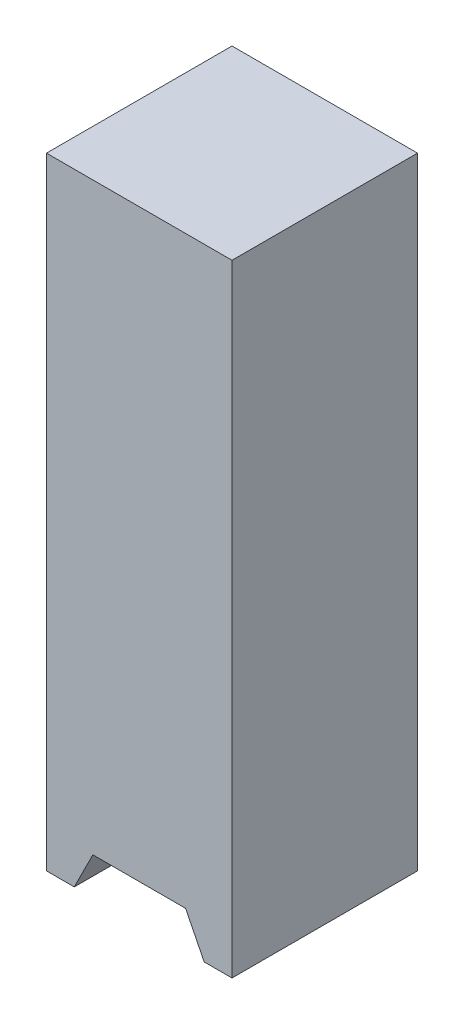
ISO-10303-21;
HEADER;
FILE_DESCRIPTION(('STEP AP214'),'2;1');
FILE_NAME('part.step','',(''),(''),'','','');
FILE_SCHEMA(('AUTOMOTIVE_DESIGN { 1 0 10303 214 1 1 1 1 }'));
ENDSEC;
DATA;
#1=APPLICATION_CONTEXT('core data for automotive mechanical design processes');
#2=APPLICATION_PROTOCOL_DEFINITION('international standard','automotive_design',2000,#1);
#3=PRODUCT_CONTEXT('',#1,'mechanical');
#4=PRODUCT('Part','Part','',(#3));
#5=PRODUCT_RELATED_PRODUCT_CATEGORY('part','',(#4));
#6=PRODUCT_DEFINITION_FORMATION('','',#4);
#7=PRODUCT_DEFINITION_CONTEXT('part definition',#1,'design');
#8=PRODUCT_DEFINITION('design','',#6,#7);
#9=PRODUCT_DEFINITION_SHAPE('','',#8);
#10=(LENGTH_UNIT() NAMED_UNIT(*) SI_UNIT(.MILLI.,.METRE.));
#11=(NAMED_UNIT(*) PLANE_ANGLE_UNIT() SI_UNIT($,.RADIAN.));
#12=(NAMED_UNIT(*) SI_UNIT($,.STERADIAN.) SOLID_ANGLE_UNIT());
#13=UNCERTAINTY_MEASURE_WITH_UNIT(LENGTH_MEASURE(1.E-05),#10,'distance_accuracy_value','');
#14=(GEOMETRIC_REPRESENTATION_CONTEXT(3) GLOBAL_UNCERTAINTY_ASSIGNED_CONTEXT((#13)) GLOBAL_UNIT_ASSIGNED_CONTEXT((#10,
#11,#12)) REPRESENTATION_CONTEXT('',''));
#15=CARTESIAN_POINT('',(0.,0.,0.));
#16=DIRECTION('',(0.,0.,1.));
#17=DIRECTION('',(1.,0.,0.));
#18=AXIS2_PLACEMENT_3D('',#15,#16,#17);
#19=CARTESIAN_POINT('',(0.,0.,0.));
#20=DIRECTION('',(0.,-1.,0.));
#21=DIRECTION('',(0.,0.,-1.));
#22=AXIS2_PLACEMENT_3D('',#19,#20,#21);
#23=PLANE('',#22);
#24=DIRECTION('',(0.,0.,-1.));
#25=VECTOR('',#24,1.);
#26=CARTESIAN_POINT('',(2.159,0.,0.));
#27=LINE('',#26,#25);
#28=CARTESIAN_POINT('',(2.159,0.,0.));
#29=VERTEX_POINT('',#28);
#30=CARTESIAN_POINT('',(2.159,0.,-2.54));
#31=VERTEX_POINT('',#30);
#32=EDGE_CURVE('E133',#29,#31,#27,.T.);
#33=ORIENTED_EDGE('',*,*,#32,.T.);
#34=DIRECTION('',(-1.,0.,0.));
#35=VECTOR('',#34,1.);
#36=CARTESIAN_POINT('',(0.,0.,-2.54));
#37=LINE('',#36,#35);
#38=CARTESIAN_POINT('',(2.54,0.,-2.54));
#39=VERTEX_POINT('',#38);
#40=EDGE_CURVE('E141',#39,#31,#37,.T.);
#41=ORIENTED_EDGE('',*,*,#40,.F.);
#42=DIRECTION('',(0.,0.,-1.));
#43=VECTOR('',#42,1.);
#44=CARTESIAN_POINT('',(2.54,0.,0.));
#45=LINE('',#44,#43);
#46=CARTESIAN_POINT('',(2.54,0.,0.));
#47=VERTEX_POINT('',#46);
#48=EDGE_CURVE('E151',#47,#39,#45,.T.);
#49=ORIENTED_EDGE('',*,*,#48,.F.);
#50=DIRECTION('',(1.,0.,0.));
#51=VECTOR('',#50,1.);
#52=CARTESIAN_POINT('',(0.,0.,0.));
#53=LINE('',#52,#51);
#54=EDGE_CURVE('E149',#29,#47,#53,.T.);
#55=ORIENTED_EDGE('',*,*,#54,.F.);
#56=EDGE_LOOP('',(#33,#41,#49,#55));
#57=FACE_BOUND('',#56,.T.);
#58=ADVANCED_FACE('F33',(#57),#23,.T.);
#59=CARTESIAN_POINT('',(0.,8.509,0.));
#60=DIRECTION('',(1.,0.,0.));
#61=DIRECTION('',(0.,0.,-1.));
#62=AXIS2_PLACEMENT_3D('',#59,#60,#61);
#63=PLANE('',#62);
#64=DIRECTION('',(0.,0.,1.));
#65=VECTOR('',#64,1.);
#66=CARTESIAN_POINT('',(0.,0.,0.));
#67=LINE('',#66,#65);
#68=CARTESIAN_POINT('',(0.,0.,-2.54));
#69=VERTEX_POINT('',#68);
#70=CARTESIAN_POINT('',(0.,0.,0.));
#71=VERTEX_POINT('',#70);
#72=EDGE_CURVE('E136',#69,#71,#67,.T.);
#73=ORIENTED_EDGE('',*,*,#72,.T.);
#74=DIRECTION('',(0.,-1.,0.));
#75=VECTOR('',#74,1.);
#76=CARTESIAN_POINT('',(0.,8.509,0.));
#77=LINE('',#76,#75);
#78=CARTESIAN_POINT('',(0.,8.509,0.));
#79=VERTEX_POINT('',#78);
#80=EDGE_CURVE('E11',#79,#71,#77,.T.);
#81=ORIENTED_EDGE('',*,*,#80,.F.);
#82=DIRECTION('',(0.,0.,1.));
#83=VECTOR('',#82,1.);
#84=CARTESIAN_POINT('',(0.,8.509,0.));
#85=LINE('',#84,#83);
#86=CARTESIAN_POINT('',(0.,8.509,-2.54));
#87=VERTEX_POINT('',#86);
#88=EDGE_CURVE('E139',#87,#79,#85,.T.);
#89=ORIENTED_EDGE('',*,*,#88,.F.);
#90=DIRECTION('',(0.,-1.,0.));
#91=VECTOR('',#90,1.);
#92=CARTESIAN_POINT('',(0.,8.509,-2.54));
#93=LINE('',#92,#91);
#94=EDGE_CURVE('E146',#87,#69,#93,.T.);
#95=ORIENTED_EDGE('',*,*,#94,.T.);
#96=EDGE_LOOP('',(#73,#81,#89,#95));
#97=FACE_BOUND('',#96,.T.);
#98=ADVANCED_FACE('F35',(#97),#63,.F.);
#99=CARTESIAN_POINT('',(0.,8.509,0.));
#100=DIRECTION('',(0.,0.,-1.));
#101=DIRECTION('',(-1.,0.,0.));
#102=AXIS2_PLACEMENT_3D('',#99,#100,#101);
#103=PLANE('',#102);
#104=DIRECTION('',(-1.,0.,0.));
#105=VECTOR('',#104,1.);
#106=CARTESIAN_POINT('',(0.,0.508,0.));
#107=LINE('',#106,#105);
#108=CARTESIAN_POINT('',(1.905,0.508,0.));
#109=VERTEX_POINT('',#108);
#110=CARTESIAN_POINT('',(0.635,0.508,0.));
#111=VERTEX_POINT('',#110);
#112=EDGE_CURVE('E107',#109,#111,#107,.T.);
#113=ORIENTED_EDGE('',*,*,#112,.F.);
#114=DIRECTION('',(0.447213595499958,-0.894427190999916,0.));
#115=VECTOR('',#114,1.);
#116=CARTESIAN_POINT('',(1.7272,0.8636,0.));
#117=LINE('',#116,#115);
#118=EDGE_CURVE('E115',#109,#29,#117,.T.);
#119=ORIENTED_EDGE('',*,*,#118,.T.);
#120=ORIENTED_EDGE('',*,*,#54,.T.);
#121=DIRECTION('',(0.,-1.,0.));
#122=VECTOR('',#121,1.);
#123=CARTESIAN_POINT('',(2.54,8.509,0.));
#124=LINE('',#123,#122);
#125=CARTESIAN_POINT('',(2.54,8.509,0.));
#126=VERTEX_POINT('',#125);
#127=EDGE_CURVE('E41',#126,#47,#124,.T.);
#128=ORIENTED_EDGE('',*,*,#127,.F.);
#129=DIRECTION('',(1.,0.,0.));
#130=VECTOR('',#129,1.);
#131=CARTESIAN_POINT('',(0.,8.509,0.));
#132=LINE('',#131,#130);
#133=EDGE_CURVE('E85',#79,#126,#132,.T.);
#134=ORIENTED_EDGE('',*,*,#133,.F.);
#135=ORIENTED_EDGE('',*,*,#80,.T.);
#136=CARTESIAN_POINT('',(0.381,0.,0.));
#137=VERTEX_POINT('',#136);
#138=EDGE_CURVE('E124',#71,#137,#53,.T.);
#139=ORIENTED_EDGE('',*,*,#138,.T.);
#140=DIRECTION('',(0.447213595499958,0.894427190999916,0.));
#141=VECTOR('',#140,1.);
#142=CARTESIAN_POINT('',(0.3048,-0.1524,0.));
#143=LINE('',#142,#141);
#144=EDGE_CURVE('E48',#137,#111,#143,.T.);
#145=ORIENTED_EDGE('',*,*,#144,.T.);
#146=EDGE_LOOP('',(#113,#119,#120,#128,#134,#135,#139,#145));
#147=FACE_BOUND('',#146,.T.);
#148=ADVANCED_FACE('F123',(#147),#103,.F.);
#149=CARTESIAN_POINT('',(2.54,8.509,0.));
#150=DIRECTION('',(-1.,0.,0.));
#151=DIRECTION('',(0.,0.,1.));
#152=AXIS2_PLACEMENT_3D('',#149,#150,#151);
#153=PLANE('',#152);
#154=ORIENTED_EDGE('',*,*,#48,.T.);
#155=DIRECTION('',(0.,-1.,0.));
#156=VECTOR('',#155,1.);
#157=CARTESIAN_POINT('',(2.54,8.509,-2.54));
#158=LINE('',#157,#156);
#159=CARTESIAN_POINT('',(2.54,8.509,-2.54));
#160=VERTEX_POINT('',#159);
#161=EDGE_CURVE('E156',#160,#39,#158,.T.);
#162=ORIENTED_EDGE('',*,*,#161,.F.);
#163=DIRECTION('',(0.,0.,-1.));
#164=VECTOR('',#163,1.);
#165=CARTESIAN_POINT('',(2.54,8.509,0.));
#166=LINE('',#165,#164);
#167=EDGE_CURVE('E143',#126,#160,#166,.T.);
#168=ORIENTED_EDGE('',*,*,#167,.F.);
#169=ORIENTED_EDGE('',*,*,#127,.T.);
#170=EDGE_LOOP('',(#154,#162,#168,#169));
#171=FACE_BOUND('',#170,.T.);
#172=ADVANCED_FACE('F162',(#171),#153,.F.);
#173=CARTESIAN_POINT('',(0.,8.509,-2.54));
#174=DIRECTION('',(0.,0.,1.));
#175=DIRECTION('',(1.,0.,0.));
#176=AXIS2_PLACEMENT_3D('',#173,#174,#175);
#177=PLANE('',#176);
#178=ORIENTED_EDGE('',*,*,#40,.T.);
#179=DIRECTION('',(0.447213595499958,-0.894427190999916,0.));
#180=VECTOR('',#179,1.);
#181=CARTESIAN_POINT('',(1.7272,0.8636,-2.54));
#182=LINE('',#181,#180);
#183=CARTESIAN_POINT('',(1.905,0.508,-2.54));
#184=VERTEX_POINT('',#183);
#185=EDGE_CURVE('E125',#184,#31,#182,.T.);
#186=ORIENTED_EDGE('',*,*,#185,.F.);
#187=DIRECTION('',(-1.,0.,0.));
#188=VECTOR('',#187,1.);
#189=CARTESIAN_POINT('',(0.,0.508,-2.54));
#190=LINE('',#189,#188);
#191=CARTESIAN_POINT('',(0.635,0.508,-2.54));
#192=VERTEX_POINT('',#191);
#193=EDGE_CURVE('E127',#184,#192,#190,.T.);
#194=ORIENTED_EDGE('',*,*,#193,.T.);
#195=DIRECTION('',(0.447213595499958,0.894427190999916,0.));
#196=VECTOR('',#195,1.);
#197=CARTESIAN_POINT('',(0.3048,-0.1524,-2.54));
#198=LINE('',#197,#196);
#199=CARTESIAN_POINT('',(0.381,0.,-2.54));
#200=VERTEX_POINT('',#199);
#201=EDGE_CURVE('E118',#200,#192,#198,.T.);
#202=ORIENTED_EDGE('',*,*,#201,.F.);
#203=EDGE_CURVE('E78',#200,#69,#37,.T.);
#204=ORIENTED_EDGE('',*,*,#203,.T.);
#205=ORIENTED_EDGE('',*,*,#94,.F.);
#206=DIRECTION('',(-1.,0.,0.));
#207=VECTOR('',#206,1.);
#208=CARTESIAN_POINT('',(0.,8.509,-2.54));
#209=LINE('',#208,#207);
#210=EDGE_CURVE('E57',#160,#87,#209,.T.);
#211=ORIENTED_EDGE('',*,*,#210,.F.);
#212=ORIENTED_EDGE('',*,*,#161,.T.);
#213=EDGE_LOOP('',(#178,#186,#194,#202,#204,#205,#211,#212));
#214=FACE_BOUND('',#213,.T.);
#215=ADVANCED_FACE('F168',(#214),#177,.F.);
#216=CARTESIAN_POINT('',(0.,8.509,0.));
#217=DIRECTION('',(0.,-1.,0.));
#218=DIRECTION('',(0.,0.,-1.));
#219=AXIS2_PLACEMENT_3D('',#216,#217,#218);
#220=PLANE('',#219);
#221=ORIENTED_EDGE('',*,*,#88,.T.);
#222=ORIENTED_EDGE('',*,*,#133,.T.);
#223=ORIENTED_EDGE('',*,*,#167,.T.);
#224=ORIENTED_EDGE('',*,*,#210,.T.);
#225=EDGE_LOOP('',(#221,#222,#223,#224));
#226=FACE_BOUND('',#225,.T.);
#227=ADVANCED_FACE('F173',(#226),#220,.F.);
#228=DIRECTION('',(0.,0.,-1.));
#229=VECTOR('',#228,1.);
#230=CARTESIAN_POINT('',(0.381,0.,0.));
#231=LINE('',#230,#229);
#232=EDGE_CURVE('E120',#137,#200,#231,.T.);
#233=ORIENTED_EDGE('',*,*,#232,.F.);
#234=ORIENTED_EDGE('',*,*,#138,.F.);
#235=ORIENTED_EDGE('',*,*,#72,.F.);
#236=ORIENTED_EDGE('',*,*,#203,.F.);
#237=EDGE_LOOP('',(#233,#234,#235,#236));
#238=FACE_BOUND('',#237,.T.);
#239=ADVANCED_FACE('F175',(#238),#23,.T.);
#240=CARTESIAN_POINT('',(1.7272,0.8636,0.));
#241=DIRECTION('',(0.894427190999916,0.447213595499958,0.));
#242=DIRECTION('',(-0.447213595499958,0.894427190999916,0.));
#243=AXIS2_PLACEMENT_3D('',#240,#241,#242);
#244=PLANE('',#243);
#245=ORIENTED_EDGE('',*,*,#185,.T.);
#246=ORIENTED_EDGE('',*,*,#32,.F.);
#247=ORIENTED_EDGE('',*,*,#118,.F.);
#248=DIRECTION('',(0.,0.,-1.));
#249=VECTOR('',#248,1.);
#250=CARTESIAN_POINT('',(1.905,0.508,0.));
#251=LINE('',#250,#249);
#252=EDGE_CURVE('E112',#109,#184,#251,.T.);
#253=ORIENTED_EDGE('',*,*,#252,.T.);
#254=EDGE_LOOP('',(#245,#246,#247,#253));
#255=FACE_BOUND('',#254,.T.);
#256=ADVANCED_FACE('F181',(#255),#244,.F.);
#257=CARTESIAN_POINT('',(0.,0.508,0.));
#258=DIRECTION('',(0.,-1.,0.));
#259=DIRECTION('',(0.,0.,-1.));
#260=AXIS2_PLACEMENT_3D('',#257,#258,#259);
#261=PLANE('',#260);
#262=ORIENTED_EDGE('',*,*,#193,.F.);
#263=ORIENTED_EDGE('',*,*,#252,.F.);
#264=ORIENTED_EDGE('',*,*,#112,.T.);
#265=DIRECTION('',(0.,0.,-1.));
#266=VECTOR('',#265,1.);
#267=CARTESIAN_POINT('',(0.635,0.508,0.));
#268=LINE('',#267,#266);
#269=EDGE_CURVE('E110',#111,#192,#268,.T.);
#270=ORIENTED_EDGE('',*,*,#269,.T.);
#271=EDGE_LOOP('',(#262,#263,#264,#270));
#272=FACE_BOUND('',#271,.T.);
#273=ADVANCED_FACE('F109',(#272),#261,.T.);
#274=CARTESIAN_POINT('',(0.3048,-0.1524,0.));
#275=DIRECTION('',(-0.894427190999916,0.447213595499958,0.));
#276=DIRECTION('',(-0.447213595499958,-0.894427190999916,0.));
#277=AXIS2_PLACEMENT_3D('',#274,#275,#276);
#278=PLANE('',#277);
#279=ORIENTED_EDGE('',*,*,#201,.T.);
#280=ORIENTED_EDGE('',*,*,#269,.F.);
#281=ORIENTED_EDGE('',*,*,#144,.F.);
#282=ORIENTED_EDGE('',*,*,#232,.T.);
#283=EDGE_LOOP('',(#279,#280,#281,#282));
#284=FACE_BOUND('',#283,.T.);
#285=ADVANCED_FACE('F117',(#284),#278,.F.);
#286=CLOSED_SHELL('',(#58,#98,#148,#172,#215,#227,#239,#256,#273,#285));
#287=MANIFOLD_SOLID_BREP('B2',#286);
#288=ADVANCED_BREP_SHAPE_REPRESENTATION('',(#18,#287),#14);
#289=SHAPE_DEFINITION_REPRESENTATION(#9,#288);
ENDSEC;
END-ISO-10303-21;
